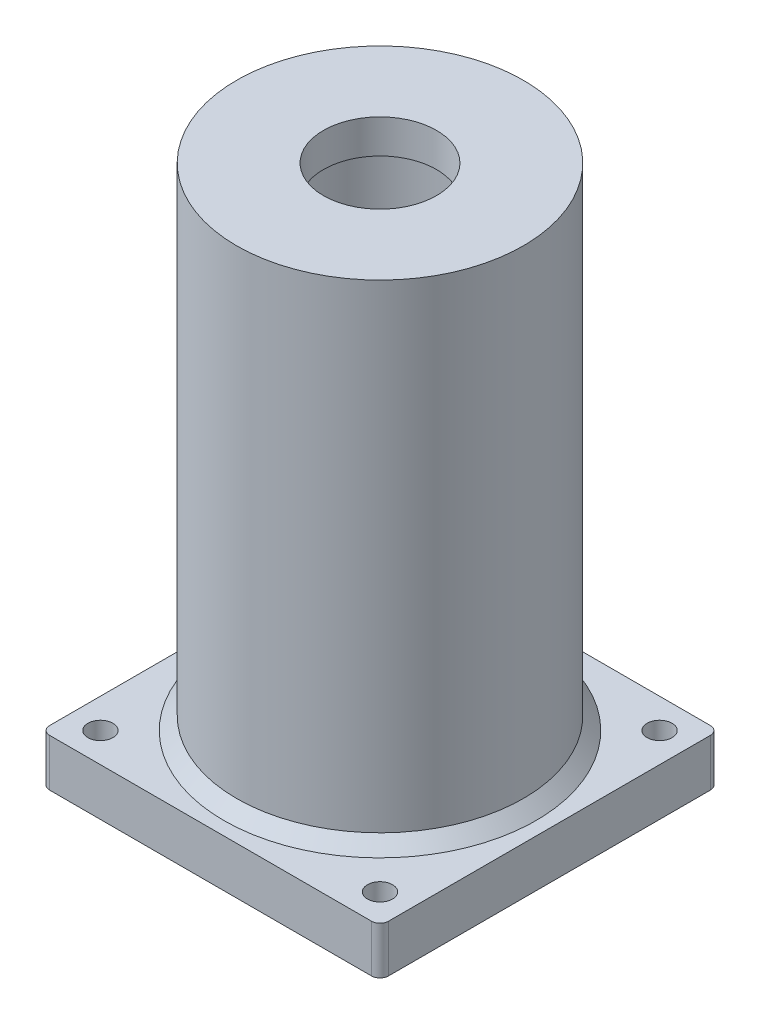
ISO-10303-21;
HEADER;
FILE_DESCRIPTION(('STEP AP214'),'2;1');
FILE_NAME('part.step','',(''),(''),'','','');
FILE_SCHEMA(('AUTOMOTIVE_DESIGN { 1 0 10303 214 1 1 1 1 }'));
ENDSEC;
DATA;
#1=APPLICATION_CONTEXT('core data for automotive mechanical design processes');
#2=APPLICATION_PROTOCOL_DEFINITION('international standard','automotive_design',2000,#1);
#3=PRODUCT_CONTEXT('',#1,'mechanical');
#4=PRODUCT('Part','Part','',(#3));
#5=PRODUCT_RELATED_PRODUCT_CATEGORY('part','',(#4));
#6=PRODUCT_DEFINITION_FORMATION('','',#4);
#7=PRODUCT_DEFINITION_CONTEXT('part definition',#1,'design');
#8=PRODUCT_DEFINITION('design','',#6,#7);
#9=PRODUCT_DEFINITION_SHAPE('','',#8);
#10=(LENGTH_UNIT() NAMED_UNIT(*) SI_UNIT(.MILLI.,.METRE.));
#11=(NAMED_UNIT(*) PLANE_ANGLE_UNIT() SI_UNIT($,.RADIAN.));
#12=(NAMED_UNIT(*) SI_UNIT($,.STERADIAN.) SOLID_ANGLE_UNIT());
#13=UNCERTAINTY_MEASURE_WITH_UNIT(LENGTH_MEASURE(1.E-05),#10,'distance_accuracy_value','');
#14=(GEOMETRIC_REPRESENTATION_CONTEXT(3) GLOBAL_UNCERTAINTY_ASSIGNED_CONTEXT((#13)) GLOBAL_UNIT_ASSIGNED_CONTEXT((#10,
#11,#12)) REPRESENTATION_CONTEXT('',''));
#15=CARTESIAN_POINT('',(0.,0.,0.));
#16=DIRECTION('',(0.,0.,1.));
#17=DIRECTION('',(1.,0.,0.));
#18=AXIS2_PLACEMENT_3D('',#15,#16,#17);
#19=CARTESIAN_POINT('',(20.,5.6,-20.));
#20=DIRECTION('',(-1.,0.,0.));
#21=DIRECTION('',(0.,0.,1.));
#22=AXIS2_PLACEMENT_3D('',#19,#20,#21);
#23=PLANE('',#22);
#24=DIRECTION('',(0.,0.,-1.));
#25=VECTOR('',#24,1.);
#26=CARTESIAN_POINT('',(20.,5.6,-20.));
#27=LINE('',#26,#25);
#28=CARTESIAN_POINT('',(20.,5.6,19.));
#29=VERTEX_POINT('',#28);
#30=CARTESIAN_POINT('',(20.,5.6,-19.));
#31=VERTEX_POINT('',#30);
#32=EDGE_CURVE('E136',#29,#31,#27,.T.);
#33=ORIENTED_EDGE('',*,*,#32,.F.);
#34=DIRECTION('',(0.,-1.,0.));
#35=VECTOR('',#34,1.);
#36=CARTESIAN_POINT('',(20.,5.6,19.));
#37=LINE('',#36,#35);
#38=CARTESIAN_POINT('',(20.,0.,19.));
#39=VERTEX_POINT('',#38);
#40=EDGE_CURVE('E120',#29,#39,#37,.T.);
#41=ORIENTED_EDGE('',*,*,#40,.T.);
#42=DIRECTION('',(0.,0.,-1.));
#43=VECTOR('',#42,1.);
#44=CARTESIAN_POINT('',(20.,0.,-20.));
#45=LINE('',#44,#43);
#46=CARTESIAN_POINT('',(20.,0.,-19.));
#47=VERTEX_POINT('',#46);
#48=EDGE_CURVE('E133',#39,#47,#45,.T.);
#49=ORIENTED_EDGE('',*,*,#48,.T.);
#50=DIRECTION('',(0.,-1.,0.));
#51=VECTOR('',#50,1.);
#52=CARTESIAN_POINT('',(20.,5.6,-19.));
#53=LINE('',#52,#51);
#54=EDGE_CURVE('E139',#47,#31,#53,.F.);
#55=ORIENTED_EDGE('',*,*,#54,.T.);
#56=EDGE_LOOP('',(#33,#41,#49,#55));
#57=FACE_BOUND('',#56,.T.);
#58=ADVANCED_FACE('F46',(#57),#23,.F.);
#59=CARTESIAN_POINT('',(-20.,5.6,-20.));
#60=DIRECTION('',(0.,0.,1.));
#61=DIRECTION('',(1.,0.,0.));
#62=AXIS2_PLACEMENT_3D('',#59,#60,#61);
#63=PLANE('',#62);
#64=DIRECTION('',(-1.,0.,0.));
#65=VECTOR('',#64,1.);
#66=CARTESIAN_POINT('',(-20.,0.,-20.));
#67=LINE('',#66,#65);
#68=CARTESIAN_POINT('',(19.,0.,-20.));
#69=VERTEX_POINT('',#68);
#70=CARTESIAN_POINT('',(-19.,0.,-20.));
#71=VERTEX_POINT('',#70);
#72=EDGE_CURVE('E144',#69,#71,#67,.T.);
#73=ORIENTED_EDGE('',*,*,#72,.T.);
#74=DIRECTION('',(0.,-1.,0.));
#75=VECTOR('',#74,1.);
#76=CARTESIAN_POINT('',(-19.,5.6,-20.));
#77=LINE('',#76,#75);
#78=CARTESIAN_POINT('',(-19.,5.6,-20.));
#79=VERTEX_POINT('',#78);
#80=EDGE_CURVE('E200',#71,#79,#77,.F.);
#81=ORIENTED_EDGE('',*,*,#80,.T.);
#82=DIRECTION('',(-1.,0.,0.));
#83=VECTOR('',#82,1.);
#84=CARTESIAN_POINT('',(-20.,5.6,-20.));
#85=LINE('',#84,#83);
#86=CARTESIAN_POINT('',(19.,5.6,-20.));
#87=VERTEX_POINT('',#86);
#88=EDGE_CURVE('E260',#87,#79,#85,.T.);
#89=ORIENTED_EDGE('',*,*,#88,.F.);
#90=DIRECTION('',(0.,-1.,0.));
#91=VECTOR('',#90,1.);
#92=CARTESIAN_POINT('',(19.,5.6,-20.));
#93=LINE('',#92,#91);
#94=EDGE_CURVE('E196',#87,#69,#93,.T.);
#95=ORIENTED_EDGE('',*,*,#94,.T.);
#96=EDGE_LOOP('',(#73,#81,#89,#95));
#97=FACE_BOUND('',#96,.T.);
#98=ADVANCED_FACE('F226',(#97),#63,.F.);
#99=CARTESIAN_POINT('',(-20.,5.6,-20.));
#100=DIRECTION('',(1.,0.,0.));
#101=DIRECTION('',(0.,0.,-1.));
#102=AXIS2_PLACEMENT_3D('',#99,#100,#101);
#103=PLANE('',#102);
#104=DIRECTION('',(0.,0.,1.));
#105=VECTOR('',#104,1.);
#106=CARTESIAN_POINT('',(-20.,0.,-20.));
#107=LINE('',#106,#105);
#108=CARTESIAN_POINT('',(-20.,0.,-19.));
#109=VERTEX_POINT('',#108);
#110=CARTESIAN_POINT('',(-20.,0.,19.));
#111=VERTEX_POINT('',#110);
#112=EDGE_CURVE('E151',#109,#111,#107,.T.);
#113=ORIENTED_EDGE('',*,*,#112,.T.);
#114=DIRECTION('',(0.,-1.,0.));
#115=VECTOR('',#114,1.);
#116=CARTESIAN_POINT('',(-20.,5.6,19.));
#117=LINE('',#116,#115);
#118=CARTESIAN_POINT('',(-20.,5.6,19.));
#119=VERTEX_POINT('',#118);
#120=EDGE_CURVE('E64',#111,#119,#117,.F.);
#121=ORIENTED_EDGE('',*,*,#120,.T.);
#122=DIRECTION('',(0.,0.,1.));
#123=VECTOR('',#122,1.);
#124=CARTESIAN_POINT('',(-20.,5.6,-20.));
#125=LINE('',#124,#123);
#126=CARTESIAN_POINT('',(-20.,5.6,-19.));
#127=VERTEX_POINT('',#126);
#128=EDGE_CURVE('E250',#127,#119,#125,.T.);
#129=ORIENTED_EDGE('',*,*,#128,.F.);
#130=DIRECTION('',(0.,-1.,0.));
#131=VECTOR('',#130,1.);
#132=CARTESIAN_POINT('',(-20.,5.6,-19.));
#133=LINE('',#132,#131);
#134=EDGE_CURVE('E191',#127,#109,#133,.T.);
#135=ORIENTED_EDGE('',*,*,#134,.T.);
#136=EDGE_LOOP('',(#113,#121,#129,#135));
#137=FACE_BOUND('',#136,.T.);
#138=ADVANCED_FACE('F231',(#137),#103,.F.);
#139=CARTESIAN_POINT('',(-20.,5.6,20.));
#140=DIRECTION('',(0.,0.,-1.));
#141=DIRECTION('',(-1.,0.,0.));
#142=AXIS2_PLACEMENT_3D('',#139,#140,#141);
#143=PLANE('',#142);
#144=DIRECTION('',(1.,0.,0.));
#145=VECTOR('',#144,1.);
#146=CARTESIAN_POINT('',(-20.,0.,20.));
#147=LINE('',#146,#145);
#148=CARTESIAN_POINT('',(-19.,0.,20.));
#149=VERTEX_POINT('',#148);
#150=CARTESIAN_POINT('',(19.,0.,20.));
#151=VERTEX_POINT('',#150);
#152=EDGE_CURVE('E163',#149,#151,#147,.T.);
#153=ORIENTED_EDGE('',*,*,#152,.T.);
#154=DIRECTION('',(0.,-1.,0.));
#155=VECTOR('',#154,1.);
#156=CARTESIAN_POINT('',(19.,5.6,20.));
#157=LINE('',#156,#155);
#158=CARTESIAN_POINT('',(19.,5.6,20.));
#159=VERTEX_POINT('',#158);
#160=EDGE_CURVE('E121',#151,#159,#157,.F.);
#161=ORIENTED_EDGE('',*,*,#160,.T.);
#162=DIRECTION('',(1.,0.,0.));
#163=VECTOR('',#162,1.);
#164=CARTESIAN_POINT('',(-20.,5.6,20.));
#165=LINE('',#164,#163);
#166=CARTESIAN_POINT('',(-19.,5.6,20.));
#167=VERTEX_POINT('',#166);
#168=EDGE_CURVE('E158',#167,#159,#165,.T.);
#169=ORIENTED_EDGE('',*,*,#168,.F.);
#170=DIRECTION('',(0.,-1.,0.));
#171=VECTOR('',#170,1.);
#172=CARTESIAN_POINT('',(-19.,5.6,20.));
#173=LINE('',#172,#171);
#174=EDGE_CURVE('E127',#167,#149,#173,.T.);
#175=ORIENTED_EDGE('',*,*,#174,.T.);
#176=EDGE_LOOP('',(#153,#161,#169,#175));
#177=FACE_BOUND('',#176,.T.);
#178=ADVANCED_FACE('F255',(#177),#143,.F.);
#179=CARTESIAN_POINT('',(0.,5.6,0.));
#180=DIRECTION('',(0.,1.,0.));
#181=DIRECTION('',(0.,0.,1.));
#182=AXIS2_PLACEMENT_3D('',#179,#180,#181);
#183=PLANE('',#182);
#184=CARTESIAN_POINT('',(0.,5.6,0.));
#185=DIRECTION('',(0.,1.,0.));
#186=DIRECTION('',(0.,0.,1.));
#187=AXIS2_PLACEMENT_3D('',#184,#185,#186);
#188=CIRCLE('',#187,18.425);
#189=CARTESIAN_POINT('',(0.,5.6,18.425));
#190=VERTEX_POINT('',#189);
#191=EDGE_CURVE('E11',#190,#190,#188,.F.);
#192=ORIENTED_EDGE('',*,*,#191,.T.);
#193=EDGE_LOOP('',(#192));
#194=FACE_BOUND('',#193,.T.);
#195=CARTESIAN_POINT('',(16.5,5.6,-16.5));
#196=DIRECTION('',(0.,1.,0.));
#197=DIRECTION('',(0.,0.,1.));
#198=AXIS2_PLACEMENT_3D('',#195,#196,#197);
#199=CIRCLE('',#198,1.475);
#200=CARTESIAN_POINT('',(16.5,5.6,-15.025));
#201=VERTEX_POINT('',#200);
#202=EDGE_CURVE('E145',#201,#201,#199,.T.);
#203=ORIENTED_EDGE('',*,*,#202,.F.);
#204=EDGE_LOOP('',(#203));
#205=FACE_BOUND('',#204,.T.);
#206=CARTESIAN_POINT('',(16.5,5.6,16.5));
#207=DIRECTION('',(0.,1.,0.));
#208=DIRECTION('',(0.,0.,1.));
#209=AXIS2_PLACEMENT_3D('',#206,#207,#208);
#210=CIRCLE('',#209,1.475);
#211=CARTESIAN_POINT('',(16.5,5.6,17.975));
#212=VERTEX_POINT('',#211);
#213=EDGE_CURVE('E155',#212,#212,#210,.T.);
#214=ORIENTED_EDGE('',*,*,#213,.F.);
#215=EDGE_LOOP('',(#214));
#216=FACE_BOUND('',#215,.T.);
#217=CARTESIAN_POINT('',(-16.5,5.6,16.5));
#218=DIRECTION('',(0.,1.,0.));
#219=DIRECTION('',(0.,0.,1.));
#220=AXIS2_PLACEMENT_3D('',#217,#218,#219);
#221=CIRCLE('',#220,1.475);
#222=CARTESIAN_POINT('',(-16.5,5.6,17.975));
#223=VERTEX_POINT('',#222);
#224=EDGE_CURVE('E274',#223,#223,#221,.T.);
#225=ORIENTED_EDGE('',*,*,#224,.F.);
#226=EDGE_LOOP('',(#225));
#227=FACE_BOUND('',#226,.T.);
#228=CARTESIAN_POINT('',(-16.5,5.6,-16.5));
#229=DIRECTION('',(0.,1.,0.));
#230=DIRECTION('',(0.,0.,1.));
#231=AXIS2_PLACEMENT_3D('',#228,#229,#230);
#232=CIRCLE('',#231,1.475);
#233=CARTESIAN_POINT('',(-16.5,5.6,-15.025));
#234=VERTEX_POINT('',#233);
#235=EDGE_CURVE('E278',#234,#234,#232,.T.);
#236=ORIENTED_EDGE('',*,*,#235,.F.);
#237=EDGE_LOOP('',(#236));
#238=FACE_BOUND('',#237,.T.);
#239=ORIENTED_EDGE('',*,*,#168,.T.);
#240=CARTESIAN_POINT('',(19.,5.6,19.));
#241=DIRECTION('',(0.,1.,0.));
#242=DIRECTION('',(0.,0.,1.));
#243=AXIS2_PLACEMENT_3D('',#240,#241,#242);
#244=CIRCLE('',#243,1.);
#245=EDGE_CURVE('E188',#159,#29,#244,.T.);
#246=ORIENTED_EDGE('',*,*,#245,.T.);
#247=ORIENTED_EDGE('',*,*,#32,.T.);
#248=CARTESIAN_POINT('',(19.,5.6,-19.));
#249=DIRECTION('',(0.,1.,0.));
#250=DIRECTION('',(0.,0.,1.));
#251=AXIS2_PLACEMENT_3D('',#248,#249,#250);
#252=CIRCLE('',#251,1.);
#253=EDGE_CURVE('E180',#31,#87,#252,.T.);
#254=ORIENTED_EDGE('',*,*,#253,.T.);
#255=ORIENTED_EDGE('',*,*,#88,.T.);
#256=CARTESIAN_POINT('',(-19.,5.6,-19.));
#257=DIRECTION('',(0.,1.,0.));
#258=DIRECTION('',(0.,0.,1.));
#259=AXIS2_PLACEMENT_3D('',#256,#257,#258);
#260=CIRCLE('',#259,1.);
#261=EDGE_CURVE('E71',#79,#127,#260,.T.);
#262=ORIENTED_EDGE('',*,*,#261,.T.);
#263=ORIENTED_EDGE('',*,*,#128,.T.);
#264=CARTESIAN_POINT('',(-19.,5.6,19.));
#265=DIRECTION('',(0.,1.,0.));
#266=DIRECTION('',(0.,0.,1.));
#267=AXIS2_PLACEMENT_3D('',#264,#265,#266);
#268=CIRCLE('',#267,1.);
#269=EDGE_CURVE('E185',#119,#167,#268,.T.);
#270=ORIENTED_EDGE('',*,*,#269,.T.);
#271=EDGE_LOOP('',(#239,#246,#247,#254,#255,#262,#263,#270));
#272=FACE_BOUND('',#271,.T.);
#273=ADVANCED_FACE('F340',(#194,#205,#216,#227,#238,#272),#183,.T.);
#274=CARTESIAN_POINT('',(0.,0.,0.));
#275=DIRECTION('',(0.,1.,0.));
#276=DIRECTION('',(0.,0.,1.));
#277=AXIS2_PLACEMENT_3D('',#274,#275,#276);
#278=PLANE('',#277);
#279=CARTESIAN_POINT('',(0.,0.,0.));
#280=DIRECTION('',(0.,1.,0.));
#281=DIRECTION('',(0.,0.,1.));
#282=AXIS2_PLACEMENT_3D('',#279,#280,#281);
#283=CIRCLE('',#282,9.125);
#284=CARTESIAN_POINT('',(0.,0.,9.125));
#285=VERTEX_POINT('',#284);
#286=EDGE_CURVE('E51',#285,#285,#283,.T.);
#287=ORIENTED_EDGE('',*,*,#286,.T.);
#288=EDGE_LOOP('',(#287));
#289=FACE_BOUND('',#288,.T.);
#290=CARTESIAN_POINT('',(16.5,0.,-16.5));
#291=DIRECTION('',(0.,-1.,0.));
#292=DIRECTION('',(0.,0.,-1.));
#293=AXIS2_PLACEMENT_3D('',#290,#291,#292);
#294=CIRCLE('',#293,1.475);
#295=CARTESIAN_POINT('',(16.5,0.,-17.975));
#296=VERTEX_POINT('',#295);
#297=EDGE_CURVE('E287',#296,#296,#294,.T.);
#298=ORIENTED_EDGE('',*,*,#297,.F.);
#299=EDGE_LOOP('',(#298));
#300=FACE_BOUND('',#299,.T.);
#301=CARTESIAN_POINT('',(16.5,0.,16.5));
#302=DIRECTION('',(0.,-1.,0.));
#303=DIRECTION('',(0.,0.,-1.));
#304=AXIS2_PLACEMENT_3D('',#301,#302,#303);
#305=CIRCLE('',#304,1.475);
#306=CARTESIAN_POINT('',(16.5,0.,15.025));
#307=VERTEX_POINT('',#306);
#308=EDGE_CURVE('E290',#307,#307,#305,.T.);
#309=ORIENTED_EDGE('',*,*,#308,.F.);
#310=EDGE_LOOP('',(#309));
#311=FACE_BOUND('',#310,.T.);
#312=CARTESIAN_POINT('',(-16.5,0.,16.5));
#313=DIRECTION('',(0.,-1.,0.));
#314=DIRECTION('',(0.,0.,-1.));
#315=AXIS2_PLACEMENT_3D('',#312,#313,#314);
#316=CIRCLE('',#315,1.475);
#317=CARTESIAN_POINT('',(-16.5,0.,15.025));
#318=VERTEX_POINT('',#317);
#319=EDGE_CURVE('E286',#318,#318,#316,.T.);
#320=ORIENTED_EDGE('',*,*,#319,.F.);
#321=EDGE_LOOP('',(#320));
#322=FACE_BOUND('',#321,.T.);
#323=CARTESIAN_POINT('',(-16.5,0.,-16.5));
#324=DIRECTION('',(0.,-1.,0.));
#325=DIRECTION('',(0.,0.,-1.));
#326=AXIS2_PLACEMENT_3D('',#323,#324,#325);
#327=CIRCLE('',#326,1.475);
#328=CARTESIAN_POINT('',(-16.5,0.,-17.975));
#329=VERTEX_POINT('',#328);
#330=EDGE_CURVE('E282',#329,#329,#327,.T.);
#331=ORIENTED_EDGE('',*,*,#330,.F.);
#332=EDGE_LOOP('',(#331));
#333=FACE_BOUND('',#332,.T.);
#334=ORIENTED_EDGE('',*,*,#48,.F.);
#335=CARTESIAN_POINT('',(19.,0.,19.));
#336=DIRECTION('',(0.,1.,0.));
#337=DIRECTION('',(0.,0.,1.));
#338=AXIS2_PLACEMENT_3D('',#335,#336,#337);
#339=CIRCLE('',#338,1.);
#340=EDGE_CURVE('E116',#39,#151,#339,.F.);
#341=ORIENTED_EDGE('',*,*,#340,.T.);
#342=ORIENTED_EDGE('',*,*,#152,.F.);
#343=CARTESIAN_POINT('',(-19.,0.,19.));
#344=DIRECTION('',(0.,1.,0.));
#345=DIRECTION('',(0.,0.,1.));
#346=AXIS2_PLACEMENT_3D('',#343,#344,#345);
#347=CIRCLE('',#346,1.);
#348=EDGE_CURVE('E128',#149,#111,#347,.F.);
#349=ORIENTED_EDGE('',*,*,#348,.T.);
#350=ORIENTED_EDGE('',*,*,#112,.F.);
#351=CARTESIAN_POINT('',(-19.,0.,-19.));
#352=DIRECTION('',(0.,1.,0.));
#353=DIRECTION('',(0.,0.,1.));
#354=AXIS2_PLACEMENT_3D('',#351,#352,#353);
#355=CIRCLE('',#354,1.);
#356=EDGE_CURVE('E170',#109,#71,#355,.F.);
#357=ORIENTED_EDGE('',*,*,#356,.T.);
#358=ORIENTED_EDGE('',*,*,#72,.F.);
#359=CARTESIAN_POINT('',(19.,0.,-19.));
#360=DIRECTION('',(0.,1.,0.));
#361=DIRECTION('',(0.,0.,1.));
#362=AXIS2_PLACEMENT_3D('',#359,#360,#361);
#363=CIRCLE('',#362,1.);
#364=EDGE_CURVE('E138',#69,#47,#363,.F.);
#365=ORIENTED_EDGE('',*,*,#364,.T.);
#366=EDGE_LOOP('',(#334,#341,#342,#349,#350,#357,#358,#365));
#367=FACE_BOUND('',#366,.T.);
#368=ADVANCED_FACE('F141',(#289,#300,#311,#322,#333,#367),#278,.F.);
#369=CARTESIAN_POINT('',(0.,59.6,0.));
#370=DIRECTION('',(0.,-1.,0.));
#371=DIRECTION('',(0.,0.,-1.));
#372=AXIS2_PLACEMENT_3D('',#369,#370,#371);
#373=CYLINDRICAL_SURFACE('',#372,16.925);
#374=CARTESIAN_POINT('',(0.,7.10000000000002,0.));
#375=DIRECTION('',(0.,1.,0.));
#376=DIRECTION('',(0.,0.,1.));
#377=AXIS2_PLACEMENT_3D('',#374,#375,#376);
#378=CIRCLE('',#377,16.925);
#379=CARTESIAN_POINT('',(0.,7.10000000000002,16.925));
#380=VERTEX_POINT('',#379);
#381=EDGE_CURVE('E57',#380,#380,#378,.T.);
#382=ORIENTED_EDGE('',*,*,#381,.T.);
#383=EDGE_LOOP('',(#382));
#384=FACE_BOUND('',#383,.T.);
#385=CARTESIAN_POINT('',(0.,63.6,0.));
#386=DIRECTION('',(0.,1.,0.));
#387=DIRECTION('',(0.,0.,1.));
#388=AXIS2_PLACEMENT_3D('',#385,#386,#387);
#389=CIRCLE('',#388,16.925);
#390=CARTESIAN_POINT('',(0.,63.6,16.925));
#391=VERTEX_POINT('',#390);
#392=EDGE_CURVE('E269',#391,#391,#389,.T.);
#393=ORIENTED_EDGE('',*,*,#392,.F.);
#394=EDGE_LOOP('',(#393));
#395=FACE_BOUND('',#394,.T.);
#396=ADVANCED_FACE('F208',(#384,#395),#373,.T.);
#397=CARTESIAN_POINT('',(0.,59.6,0.));
#398=DIRECTION('',(0.,-1.,0.));
#399=DIRECTION('',(0.,0.,-1.));
#400=AXIS2_PLACEMENT_3D('',#397,#398,#399);
#401=CYLINDRICAL_SURFACE('',#400,9.125);
#402=CARTESIAN_POINT('',(0.,59.6,0.));
#403=DIRECTION('',(0.,1.,0.));
#404=DIRECTION('',(0.,0.,1.));
#405=AXIS2_PLACEMENT_3D('',#402,#403,#404);
#406=CIRCLE('',#405,9.125);
#407=CARTESIAN_POINT('',(0.,59.6,9.125));
#408=VERTEX_POINT('',#407);
#409=EDGE_CURVE('E266',#408,#408,#406,.T.);
#410=ORIENTED_EDGE('',*,*,#409,.T.);
#411=EDGE_LOOP('',(#410));
#412=FACE_BOUND('',#411,.T.);
#413=ORIENTED_EDGE('',*,*,#286,.F.);
#414=EDGE_LOOP('',(#413));
#415=FACE_BOUND('',#414,.T.);
#416=ADVANCED_FACE('F333',(#412,#415),#401,.F.);
#417=CARTESIAN_POINT('',(-16.5,10.,-16.5));
#418=DIRECTION('',(0.,-1.,0.));
#419=DIRECTION('',(0.,0.,-1.));
#420=AXIS2_PLACEMENT_3D('',#417,#418,#419);
#421=CYLINDRICAL_SURFACE('',#420,1.475);
#422=ORIENTED_EDGE('',*,*,#235,.T.);
#423=EDGE_LOOP('',(#422));
#424=FACE_BOUND('',#423,.T.);
#425=ORIENTED_EDGE('',*,*,#330,.T.);
#426=EDGE_LOOP('',(#425));
#427=FACE_BOUND('',#426,.T.);
#428=ADVANCED_FACE('F323',(#424,#427),#421,.F.);
#429=CARTESIAN_POINT('',(-16.5,10.,16.5));
#430=DIRECTION('',(0.,-1.,0.));
#431=DIRECTION('',(0.,0.,-1.));
#432=AXIS2_PLACEMENT_3D('',#429,#430,#431);
#433=CYLINDRICAL_SURFACE('',#432,1.475);
#434=ORIENTED_EDGE('',*,*,#224,.T.);
#435=EDGE_LOOP('',(#434));
#436=FACE_BOUND('',#435,.T.);
#437=ORIENTED_EDGE('',*,*,#319,.T.);
#438=EDGE_LOOP('',(#437));
#439=FACE_BOUND('',#438,.T.);
#440=ADVANCED_FACE('F319',(#436,#439),#433,.F.);
#441=CARTESIAN_POINT('',(16.5,10.,16.5));
#442=DIRECTION('',(0.,-1.,0.));
#443=DIRECTION('',(0.,0.,-1.));
#444=AXIS2_PLACEMENT_3D('',#441,#442,#443);
#445=CYLINDRICAL_SURFACE('',#444,1.475);
#446=ORIENTED_EDGE('',*,*,#213,.T.);
#447=EDGE_LOOP('',(#446));
#448=FACE_BOUND('',#447,.T.);
#449=ORIENTED_EDGE('',*,*,#308,.T.);
#450=EDGE_LOOP('',(#449));
#451=FACE_BOUND('',#450,.T.);
#452=ADVANCED_FACE('F322',(#448,#451),#445,.F.);
#453=CARTESIAN_POINT('',(16.5,10.,-16.5));
#454=DIRECTION('',(0.,-1.,0.));
#455=DIRECTION('',(0.,0.,-1.));
#456=AXIS2_PLACEMENT_3D('',#453,#454,#455);
#457=CYLINDRICAL_SURFACE('',#456,1.475);
#458=ORIENTED_EDGE('',*,*,#202,.T.);
#459=EDGE_LOOP('',(#458));
#460=FACE_BOUND('',#459,.T.);
#461=ORIENTED_EDGE('',*,*,#297,.T.);
#462=EDGE_LOOP('',(#461));
#463=FACE_BOUND('',#462,.T.);
#464=ADVANCED_FACE('F239',(#460,#463),#457,.F.);
#465=CARTESIAN_POINT('',(19.,5.6,19.));
#466=DIRECTION('',(0.,-1.,0.));
#467=DIRECTION('',(0.,0.,-1.));
#468=AXIS2_PLACEMENT_3D('',#465,#466,#467);
#469=CYLINDRICAL_SURFACE('',#468,1.);
#470=ORIENTED_EDGE('',*,*,#245,.F.);
#471=ORIENTED_EDGE('',*,*,#160,.F.);
#472=ORIENTED_EDGE('',*,*,#340,.F.);
#473=ORIENTED_EDGE('',*,*,#40,.F.);
#474=EDGE_LOOP('',(#470,#471,#472,#473));
#475=FACE_BOUND('',#474,.T.);
#476=ADVANCED_FACE('F119',(#475),#469,.T.);
#477=CARTESIAN_POINT('',(-19.,5.6,19.));
#478=DIRECTION('',(0.,-1.,0.));
#479=DIRECTION('',(0.,0.,-1.));
#480=AXIS2_PLACEMENT_3D('',#477,#478,#479);
#481=CYLINDRICAL_SURFACE('',#480,1.);
#482=ORIENTED_EDGE('',*,*,#269,.F.);
#483=ORIENTED_EDGE('',*,*,#120,.F.);
#484=ORIENTED_EDGE('',*,*,#348,.F.);
#485=ORIENTED_EDGE('',*,*,#174,.F.);
#486=EDGE_LOOP('',(#482,#483,#484,#485));
#487=FACE_BOUND('',#486,.T.);
#488=ADVANCED_FACE('F238',(#487),#481,.T.);
#489=CARTESIAN_POINT('',(-19.,5.6,-19.));
#490=DIRECTION('',(0.,-1.,0.));
#491=DIRECTION('',(0.,0.,-1.));
#492=AXIS2_PLACEMENT_3D('',#489,#490,#491);
#493=CYLINDRICAL_SURFACE('',#492,1.);
#494=ORIENTED_EDGE('',*,*,#261,.F.);
#495=ORIENTED_EDGE('',*,*,#80,.F.);
#496=ORIENTED_EDGE('',*,*,#356,.F.);
#497=ORIENTED_EDGE('',*,*,#134,.F.);
#498=EDGE_LOOP('',(#494,#495,#496,#497));
#499=FACE_BOUND('',#498,.T.);
#500=ADVANCED_FACE('F222',(#499),#493,.T.);
#501=CARTESIAN_POINT('',(19.,5.6,-19.));
#502=DIRECTION('',(0.,-1.,0.));
#503=DIRECTION('',(0.,0.,-1.));
#504=AXIS2_PLACEMENT_3D('',#501,#502,#503);
#505=CYLINDRICAL_SURFACE('',#504,1.);
#506=ORIENTED_EDGE('',*,*,#253,.F.);
#507=ORIENTED_EDGE('',*,*,#54,.F.);
#508=ORIENTED_EDGE('',*,*,#364,.F.);
#509=ORIENTED_EDGE('',*,*,#94,.F.);
#510=EDGE_LOOP('',(#506,#507,#508,#509));
#511=FACE_BOUND('',#510,.T.);
#512=ADVANCED_FACE('F213',(#511),#505,.T.);
#513=CARTESIAN_POINT('',(0.,7.10000000000002,0.));
#514=DIRECTION('',(0.,-1.,0.));
#515=DIRECTION('',(0.,0.,-1.));
#516=AXIS2_PLACEMENT_3D('',#513,#514,#515);
#517=CONICAL_SURFACE('',#516,16.925,0.785398163397445);
#518=ORIENTED_EDGE('',*,*,#191,.F.);
#519=EDGE_LOOP('',(#518));
#520=FACE_BOUND('',#519,.T.);
#521=ORIENTED_EDGE('',*,*,#381,.F.);
#522=EDGE_LOOP('',(#521));
#523=FACE_BOUND('',#522,.T.);
#524=ADVANCED_FACE('F49',(#520,#523),#517,.T.);
#525=CARTESIAN_POINT('',(0.,59.6,0.));
#526=DIRECTION('',(0.,1.,0.));
#527=DIRECTION('',(0.,0.,1.));
#528=AXIS2_PLACEMENT_3D('',#525,#526,#527);
#529=PLANE('',#528);
#530=CARTESIAN_POINT('',(0.,59.6,0.));
#531=DIRECTION('',(0.,1.,0.));
#532=DIRECTION('',(0.,0.,1.));
#533=AXIS2_PLACEMENT_3D('',#530,#531,#532);
#534=CIRCLE('',#533,6.675);
#535=CARTESIAN_POINT('',(0.,59.6,6.675));
#536=VERTEX_POINT('',#535);
#537=EDGE_CURVE('E300',#536,#536,#534,.T.);
#538=ORIENTED_EDGE('',*,*,#537,.T.);
#539=EDGE_LOOP('',(#538));
#540=FACE_BOUND('',#539,.T.);
#541=ORIENTED_EDGE('',*,*,#409,.F.);
#542=EDGE_LOOP('',(#541));
#543=FACE_BOUND('',#542,.T.);
#544=ADVANCED_FACE('F212',(#540,#543),#529,.F.);
#545=CARTESIAN_POINT('',(0.,63.6,0.));
#546=DIRECTION('',(0.,1.,0.));
#547=DIRECTION('',(0.,0.,1.));
#548=AXIS2_PLACEMENT_3D('',#545,#546,#547);
#549=PLANE('',#548);
#550=ORIENTED_EDGE('',*,*,#392,.T.);
#551=EDGE_LOOP('',(#550));
#552=FACE_BOUND('',#551,.T.);
#553=CARTESIAN_POINT('',(0.,63.6,0.));
#554=DIRECTION('',(0.,1.,0.));
#555=DIRECTION('',(0.,0.,1.));
#556=AXIS2_PLACEMENT_3D('',#553,#554,#555);
#557=CIRCLE('',#556,6.675);
#558=CARTESIAN_POINT('',(0.,63.6,6.675));
#559=VERTEX_POINT('',#558);
#560=EDGE_CURVE('E299',#559,#559,#557,.T.);
#561=ORIENTED_EDGE('',*,*,#560,.F.);
#562=EDGE_LOOP('',(#561));
#563=FACE_BOUND('',#562,.T.);
#564=ADVANCED_FACE('F219',(#552,#563),#549,.T.);
#565=CARTESIAN_POINT('',(0.,63.6,0.));
#566=DIRECTION('',(0.,-1.,0.));
#567=DIRECTION('',(0.,0.,-1.));
#568=AXIS2_PLACEMENT_3D('',#565,#566,#567);
#569=CYLINDRICAL_SURFACE('',#568,6.675);
#570=ORIENTED_EDGE('',*,*,#560,.T.);
#571=EDGE_LOOP('',(#570));
#572=FACE_BOUND('',#571,.T.);
#573=ORIENTED_EDGE('',*,*,#537,.F.);
#574=EDGE_LOOP('',(#573));
#575=FACE_BOUND('',#574,.T.);
#576=ADVANCED_FACE('F308',(#572,#575),#569,.F.);
#577=CLOSED_SHELL('',(#58,#98,#138,#178,#273,#368,#396,#416,#428,#440,#452,#464,#476,#488,#500,
#512,#524,#544,#564,#576));
#578=MANIFOLD_SOLID_BREP('B2',#577);
#579=ADVANCED_BREP_SHAPE_REPRESENTATION('',(#18,#578),#14);
#580=SHAPE_DEFINITION_REPRESENTATION(#9,#579);
ENDSEC;
END-ISO-10303-21;
